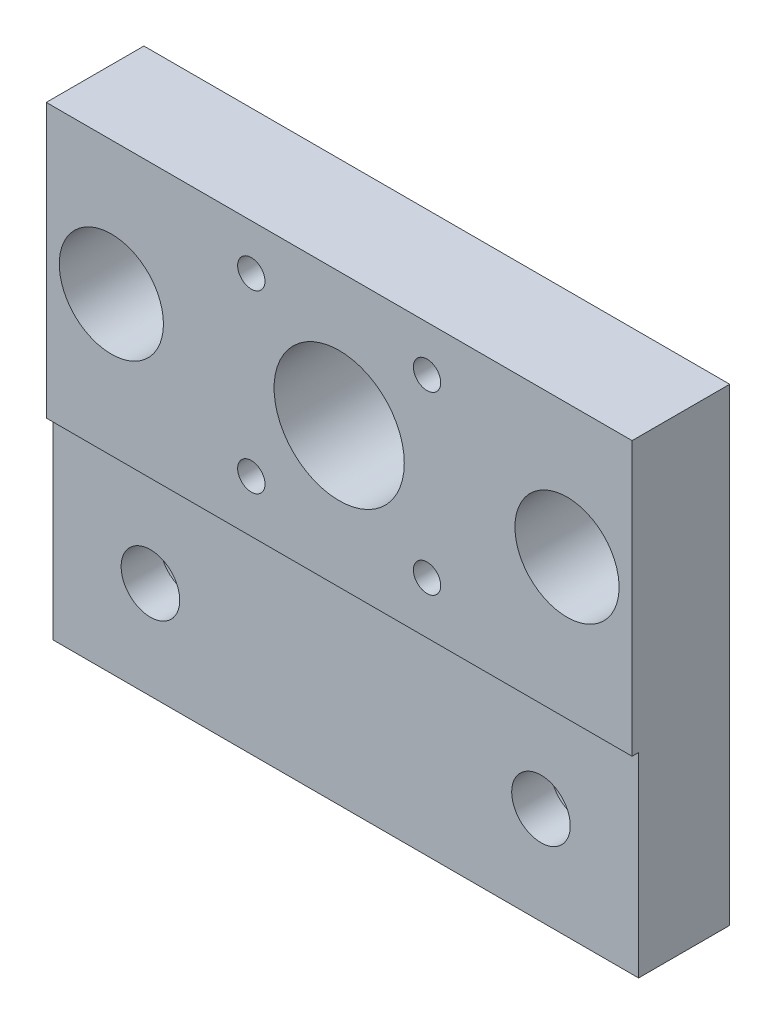
ISO-10303-21;
HEADER;
FILE_DESCRIPTION(('STEP AP214'),'2;1');
FILE_NAME('part.step','',(''),(''),'','','');
FILE_SCHEMA(('AUTOMOTIVE_DESIGN { 1 0 10303 214 1 1 1 1 }'));
ENDSEC;
DATA;
#1=APPLICATION_CONTEXT('core data for automotive mechanical design processes');
#2=APPLICATION_PROTOCOL_DEFINITION('international standard','automotive_design',2000,#1);
#3=PRODUCT_CONTEXT('',#1,'mechanical');
#4=PRODUCT('Part','Part','',(#3));
#5=PRODUCT_RELATED_PRODUCT_CATEGORY('part','',(#4));
#6=PRODUCT_DEFINITION_FORMATION('','',#4);
#7=PRODUCT_DEFINITION_CONTEXT('part definition',#1,'design');
#8=PRODUCT_DEFINITION('design','',#6,#7);
#9=PRODUCT_DEFINITION_SHAPE('','',#8);
#10=(LENGTH_UNIT() NAMED_UNIT(*) SI_UNIT(.MILLI.,.METRE.));
#11=(NAMED_UNIT(*) PLANE_ANGLE_UNIT() SI_UNIT($,.RADIAN.));
#12=(NAMED_UNIT(*) SI_UNIT($,.STERADIAN.) SOLID_ANGLE_UNIT());
#13=UNCERTAINTY_MEASURE_WITH_UNIT(LENGTH_MEASURE(1.E-05),#10,'distance_accuracy_value','');
#14=(GEOMETRIC_REPRESENTATION_CONTEXT(3) GLOBAL_UNCERTAINTY_ASSIGNED_CONTEXT((#13)) GLOBAL_UNIT_ASSIGNED_CONTEXT((#10,
#11,#12)) REPRESENTATION_CONTEXT('',''));
#15=CARTESIAN_POINT('',(0.,0.,0.));
#16=DIRECTION('',(0.,0.,1.));
#17=DIRECTION('',(1.,0.,0.));
#18=AXIS2_PLACEMENT_3D('',#15,#16,#17);
#19=CARTESIAN_POINT('',(45.,-36.,15.));
#20=DIRECTION('',(-1.,0.,0.));
#21=DIRECTION('',(0.,0.,1.));
#22=AXIS2_PLACEMENT_3D('',#19,#20,#21);
#23=PLANE('',#22);
#24=DIRECTION('',(0.,1.,0.));
#25=VECTOR('',#24,1.);
#26=CARTESIAN_POINT('',(45.,-36.,15.));
#27=LINE('',#26,#25);
#28=CARTESIAN_POINT('',(45.,-6.,15.));
#29=VERTEX_POINT('',#28);
#30=CARTESIAN_POINT('',(45.,36.,15.));
#31=VERTEX_POINT('',#30);
#32=EDGE_CURVE('E99',#29,#31,#27,.T.);
#33=ORIENTED_EDGE('',*,*,#32,.F.);
#34=DIRECTION('',(0.,0.,1.));
#35=VECTOR('',#34,1.);
#36=CARTESIAN_POINT('',(45.,-6.,14.));
#37=LINE('',#36,#35);
#38=CARTESIAN_POINT('',(45.,-6.,14.));
#39=VERTEX_POINT('',#38);
#40=EDGE_CURVE('E49',#39,#29,#37,.T.);
#41=ORIENTED_EDGE('',*,*,#40,.F.);
#42=DIRECTION('',(0.,1.,0.));
#43=VECTOR('',#42,1.);
#44=CARTESIAN_POINT('',(45.,-36.,14.));
#45=LINE('',#44,#43);
#46=CARTESIAN_POINT('',(45.,-36.,14.));
#47=VERTEX_POINT('',#46);
#48=EDGE_CURVE('E86',#47,#39,#45,.T.);
#49=ORIENTED_EDGE('',*,*,#48,.F.);
#50=DIRECTION('',(0.,0.,-1.));
#51=VECTOR('',#50,1.);
#52=CARTESIAN_POINT('',(45.,-36.,15.));
#53=LINE('',#52,#51);
#54=CARTESIAN_POINT('',(45.,-36.,0.));
#55=VERTEX_POINT('',#54);
#56=EDGE_CURVE('E78',#47,#55,#53,.T.);
#57=ORIENTED_EDGE('',*,*,#56,.T.);
#58=DIRECTION('',(0.,1.,0.));
#59=VECTOR('',#58,1.);
#60=CARTESIAN_POINT('',(45.,-36.,0.));
#61=LINE('',#60,#59);
#62=CARTESIAN_POINT('',(45.,36.,0.));
#63=VERTEX_POINT('',#62);
#64=EDGE_CURVE('E83',#55,#63,#61,.T.);
#65=ORIENTED_EDGE('',*,*,#64,.T.);
#66=DIRECTION('',(0.,0.,-1.));
#67=VECTOR('',#66,1.);
#68=CARTESIAN_POINT('',(45.,36.,15.));
#69=LINE('',#68,#67);
#70=EDGE_CURVE('E11',#31,#63,#69,.T.);
#71=ORIENTED_EDGE('',*,*,#70,.F.);
#72=EDGE_LOOP('',(#33,#41,#49,#57,#65,#71));
#73=FACE_BOUND('',#72,.T.);
#74=ADVANCED_FACE('F33',(#73),#23,.F.);
#75=CARTESIAN_POINT('',(-45.,36.,15.));
#76=DIRECTION('',(0.,-1.,0.));
#77=DIRECTION('',(0.,0.,-1.));
#78=AXIS2_PLACEMENT_3D('',#75,#76,#77);
#79=PLANE('',#78);
#80=DIRECTION('',(-1.,0.,0.));
#81=VECTOR('',#80,1.);
#82=CARTESIAN_POINT('',(-45.,36.,0.));
#83=LINE('',#82,#81);
#84=CARTESIAN_POINT('',(-45.,36.,0.));
#85=VERTEX_POINT('',#84);
#86=EDGE_CURVE('E103',#63,#85,#83,.T.);
#87=ORIENTED_EDGE('',*,*,#86,.T.);
#88=DIRECTION('',(0.,0.,-1.));
#89=VECTOR('',#88,1.);
#90=CARTESIAN_POINT('',(-45.,36.,15.));
#91=LINE('',#90,#89);
#92=CARTESIAN_POINT('',(-45.,36.,15.));
#93=VERTEX_POINT('',#92);
#94=EDGE_CURVE('E41',#93,#85,#91,.T.);
#95=ORIENTED_EDGE('',*,*,#94,.F.);
#96=DIRECTION('',(-1.,0.,0.));
#97=VECTOR('',#96,1.);
#98=CARTESIAN_POINT('',(-45.,36.,15.));
#99=LINE('',#98,#97);
#100=EDGE_CURVE('E58',#31,#93,#99,.T.);
#101=ORIENTED_EDGE('',*,*,#100,.F.);
#102=ORIENTED_EDGE('',*,*,#70,.T.);
#103=EDGE_LOOP('',(#87,#95,#101,#102));
#104=FACE_BOUND('',#103,.T.);
#105=ADVANCED_FACE('F191',(#104),#79,.F.);
#106=CARTESIAN_POINT('',(-45.,-36.,15.));
#107=DIRECTION('',(1.,0.,0.));
#108=DIRECTION('',(0.,0.,-1.));
#109=AXIS2_PLACEMENT_3D('',#106,#107,#108);
#110=PLANE('',#109);
#111=DIRECTION('',(0.,-1.,0.));
#112=VECTOR('',#111,1.);
#113=CARTESIAN_POINT('',(-45.,-36.,14.));
#114=LINE('',#113,#112);
#115=CARTESIAN_POINT('',(-45.,-6.,14.));
#116=VERTEX_POINT('',#115);
#117=CARTESIAN_POINT('',(-45.,-36.,14.));
#118=VERTEX_POINT('',#117);
#119=EDGE_CURVE('E149',#116,#118,#114,.T.);
#120=ORIENTED_EDGE('',*,*,#119,.F.);
#121=DIRECTION('',(0.,0.,1.));
#122=VECTOR('',#121,1.);
#123=CARTESIAN_POINT('',(-45.,-6.,14.));
#124=LINE('',#123,#122);
#125=CARTESIAN_POINT('',(-45.,-6.,15.));
#126=VERTEX_POINT('',#125);
#127=EDGE_CURVE('E104',#116,#126,#124,.T.);
#128=ORIENTED_EDGE('',*,*,#127,.T.);
#129=DIRECTION('',(0.,-1.,0.));
#130=VECTOR('',#129,1.);
#131=CARTESIAN_POINT('',(-45.,-36.,15.));
#132=LINE('',#131,#130);
#133=EDGE_CURVE('E90',#93,#126,#132,.T.);
#134=ORIENTED_EDGE('',*,*,#133,.F.);
#135=ORIENTED_EDGE('',*,*,#94,.T.);
#136=DIRECTION('',(0.,-1.,0.));
#137=VECTOR('',#136,1.);
#138=CARTESIAN_POINT('',(-45.,-36.,0.));
#139=LINE('',#138,#137);
#140=CARTESIAN_POINT('',(-45.,-36.,0.));
#141=VERTEX_POINT('',#140);
#142=EDGE_CURVE('E100',#85,#141,#139,.T.);
#143=ORIENTED_EDGE('',*,*,#142,.T.);
#144=DIRECTION('',(0.,0.,-1.));
#145=VECTOR('',#144,1.);
#146=CARTESIAN_POINT('',(-45.,-36.,15.));
#147=LINE('',#146,#145);
#148=EDGE_CURVE('E89',#118,#141,#147,.T.);
#149=ORIENTED_EDGE('',*,*,#148,.F.);
#150=EDGE_LOOP('',(#120,#128,#134,#135,#143,#149));
#151=FACE_BOUND('',#150,.T.);
#152=ADVANCED_FACE('F167',(#151),#110,.F.);
#153=CARTESIAN_POINT('',(-45.,-36.,15.));
#154=DIRECTION('',(0.,1.,0.));
#155=DIRECTION('',(0.,0.,1.));
#156=AXIS2_PLACEMENT_3D('',#153,#154,#155);
#157=PLANE('',#156);
#158=ORIENTED_EDGE('',*,*,#56,.F.);
#159=DIRECTION('',(1.,0.,0.));
#160=VECTOR('',#159,1.);
#161=CARTESIAN_POINT('',(-45.,-36.,14.));
#162=LINE('',#161,#160);
#163=EDGE_CURVE('E152',#118,#47,#162,.T.);
#164=ORIENTED_EDGE('',*,*,#163,.F.);
#165=ORIENTED_EDGE('',*,*,#148,.T.);
#166=DIRECTION('',(1.,0.,0.));
#167=VECTOR('',#166,1.);
#168=CARTESIAN_POINT('',(-45.,-36.,0.));
#169=LINE('',#168,#167);
#170=EDGE_CURVE('E93',#141,#55,#169,.T.);
#171=ORIENTED_EDGE('',*,*,#170,.T.);
#172=EDGE_LOOP('',(#158,#164,#165,#171));
#173=FACE_BOUND('',#172,.T.);
#174=ADVANCED_FACE('F94',(#173),#157,.F.);
#175=CARTESIAN_POINT('',(0.,0.,15.));
#176=DIRECTION('',(0.,0.,-1.));
#177=DIRECTION('',(-1.,0.,0.));
#178=AXIS2_PLACEMENT_3D('',#175,#176,#177);
#179=PLANE('',#178);
#180=CARTESIAN_POINT('',(-13.5,1.99999999999984,15.));
#181=DIRECTION('',(0.,0.,-1.));
#182=DIRECTION('',(-1.,0.,0.));
#183=AXIS2_PLACEMENT_3D('',#180,#181,#182);
#184=CIRCLE('',#183,2.1);
#185=CARTESIAN_POINT('',(-15.6,1.99999999999984,15.));
#186=VERTEX_POINT('',#185);
#187=EDGE_CURVE('E213',#186,#186,#184,.T.);
#188=ORIENTED_EDGE('',*,*,#187,.T.);
#189=EDGE_LOOP('',(#188));
#190=FACE_BOUND('',#189,.T.);
#191=CARTESIAN_POINT('',(-13.5,28.9999999999998,15.));
#192=DIRECTION('',(0.,0.,-1.));
#193=DIRECTION('',(-1.,0.,0.));
#194=AXIS2_PLACEMENT_3D('',#191,#192,#193);
#195=CIRCLE('',#194,2.1);
#196=CARTESIAN_POINT('',(-15.6,28.9999999999998,15.));
#197=VERTEX_POINT('',#196);
#198=EDGE_CURVE('E217',#197,#197,#195,.T.);
#199=ORIENTED_EDGE('',*,*,#198,.T.);
#200=EDGE_LOOP('',(#199));
#201=FACE_BOUND('',#200,.T.);
#202=CARTESIAN_POINT('',(13.5,28.9999999999998,15.));
#203=DIRECTION('',(0.,0.,-1.));
#204=DIRECTION('',(-1.,0.,0.));
#205=AXIS2_PLACEMENT_3D('',#202,#203,#204);
#206=CIRCLE('',#205,2.1);
#207=CARTESIAN_POINT('',(11.4,28.9999999999998,15.));
#208=VERTEX_POINT('',#207);
#209=EDGE_CURVE('E221',#208,#208,#206,.T.);
#210=ORIENTED_EDGE('',*,*,#209,.T.);
#211=EDGE_LOOP('',(#210));
#212=FACE_BOUND('',#211,.T.);
#213=CARTESIAN_POINT('',(13.5,1.99999999999985,15.));
#214=DIRECTION('',(0.,0.,-1.));
#215=DIRECTION('',(-1.,0.,0.));
#216=AXIS2_PLACEMENT_3D('',#213,#214,#215);
#217=CIRCLE('',#216,2.1);
#218=CARTESIAN_POINT('',(11.4,1.99999999999985,15.));
#219=VERTEX_POINT('',#218);
#220=EDGE_CURVE('E225',#219,#219,#217,.T.);
#221=ORIENTED_EDGE('',*,*,#220,.T.);
#222=EDGE_LOOP('',(#221));
#223=FACE_BOUND('',#222,.T.);
#224=CARTESIAN_POINT('',(35.,15.4999999999998,15.));
#225=DIRECTION('',(0.,0.,1.));
#226=DIRECTION('',(-1.,0.,0.));
#227=AXIS2_PLACEMENT_3D('',#224,#225,#226);
#228=CIRCLE('',#227,8.);
#229=CARTESIAN_POINT('',(27.,15.4999999999998,15.));
#230=VERTEX_POINT('',#229);
#231=EDGE_CURVE('E117',#230,#230,#228,.T.);
#232=ORIENTED_EDGE('',*,*,#231,.F.);
#233=EDGE_LOOP('',(#232));
#234=FACE_BOUND('',#233,.T.);
#235=CARTESIAN_POINT('',(-35.,15.4999999999998,15.));
#236=DIRECTION('',(0.,0.,1.));
#237=DIRECTION('',(1.,0.,0.));
#238=AXIS2_PLACEMENT_3D('',#235,#236,#237);
#239=CIRCLE('',#238,8.);
#240=CARTESIAN_POINT('',(-27.,15.4999999999998,15.));
#241=VERTEX_POINT('',#240);
#242=EDGE_CURVE('E138',#241,#241,#239,.T.);
#243=ORIENTED_EDGE('',*,*,#242,.F.);
#244=EDGE_LOOP('',(#243));
#245=FACE_BOUND('',#244,.T.);
#246=CARTESIAN_POINT('',(0.,15.4999999999998,15.));
#247=DIRECTION('',(0.,0.,1.));
#248=DIRECTION('',(1.,0.,0.));
#249=AXIS2_PLACEMENT_3D('',#246,#247,#248);
#250=CIRCLE('',#249,10.);
#251=CARTESIAN_POINT('',(10.,15.4999999999998,15.));
#252=VERTEX_POINT('',#251);
#253=EDGE_CURVE('E137',#252,#252,#250,.T.);
#254=ORIENTED_EDGE('',*,*,#253,.F.);
#255=EDGE_LOOP('',(#254));
#256=FACE_BOUND('',#255,.T.);
#257=ORIENTED_EDGE('',*,*,#133,.T.);
#258=DIRECTION('',(-1.,0.,0.));
#259=VECTOR('',#258,1.);
#260=CARTESIAN_POINT('',(-45.,-6.,15.));
#261=LINE('',#260,#259);
#262=EDGE_CURVE('E146',#29,#126,#261,.T.);
#263=ORIENTED_EDGE('',*,*,#262,.F.);
#264=ORIENTED_EDGE('',*,*,#32,.T.);
#265=ORIENTED_EDGE('',*,*,#100,.T.);
#266=EDGE_LOOP('',(#257,#263,#264,#265));
#267=FACE_BOUND('',#266,.T.);
#268=ADVANCED_FACE('F163',(#190,#201,#212,#223,#234,#245,#256,#267),#179,.F.);
#269=CARTESIAN_POINT('',(0.,0.,0.));
#270=DIRECTION('',(0.,0.,-1.));
#271=DIRECTION('',(-1.,0.,0.));
#272=AXIS2_PLACEMENT_3D('',#269,#270,#271);
#273=PLANE('',#272);
#274=CARTESIAN_POINT('',(-13.5,1.99999999999984,0.));
#275=DIRECTION('',(0.,0.,-1.));
#276=DIRECTION('',(-1.,0.,0.));
#277=AXIS2_PLACEMENT_3D('',#274,#275,#276);
#278=CIRCLE('',#277,2.1);
#279=CARTESIAN_POINT('',(-15.6,1.99999999999984,0.));
#280=VERTEX_POINT('',#279);
#281=EDGE_CURVE('E287',#280,#280,#278,.T.);
#282=ORIENTED_EDGE('',*,*,#281,.F.);
#283=EDGE_LOOP('',(#282));
#284=FACE_BOUND('',#283,.T.);
#285=CARTESIAN_POINT('',(-13.5,28.9999999999998,0.));
#286=DIRECTION('',(0.,0.,-1.));
#287=DIRECTION('',(-1.,0.,0.));
#288=AXIS2_PLACEMENT_3D('',#285,#286,#287);
#289=CIRCLE('',#288,2.1);
#290=CARTESIAN_POINT('',(-15.6,28.9999999999998,0.));
#291=VERTEX_POINT('',#290);
#292=EDGE_CURVE('E289',#291,#291,#289,.T.);
#293=ORIENTED_EDGE('',*,*,#292,.F.);
#294=EDGE_LOOP('',(#293));
#295=FACE_BOUND('',#294,.T.);
#296=CARTESIAN_POINT('',(13.5,28.9999999999998,0.));
#297=DIRECTION('',(0.,0.,-1.));
#298=DIRECTION('',(-1.,0.,0.));
#299=AXIS2_PLACEMENT_3D('',#296,#297,#298);
#300=CIRCLE('',#299,2.1);
#301=CARTESIAN_POINT('',(11.4,28.9999999999998,0.));
#302=VERTEX_POINT('',#301);
#303=EDGE_CURVE('E295',#302,#302,#300,.T.);
#304=ORIENTED_EDGE('',*,*,#303,.F.);
#305=EDGE_LOOP('',(#304));
#306=FACE_BOUND('',#305,.T.);
#307=CARTESIAN_POINT('',(13.5,1.99999999999985,0.));
#308=DIRECTION('',(0.,0.,-1.));
#309=DIRECTION('',(-1.,0.,0.));
#310=AXIS2_PLACEMENT_3D('',#307,#308,#309);
#311=CIRCLE('',#310,2.1);
#312=CARTESIAN_POINT('',(11.4,1.99999999999985,0.));
#313=VERTEX_POINT('',#312);
#314=EDGE_CURVE('E299',#313,#313,#311,.T.);
#315=ORIENTED_EDGE('',*,*,#314,.F.);
#316=EDGE_LOOP('',(#315));
#317=FACE_BOUND('',#316,.T.);
#318=CARTESIAN_POINT('',(-30.,-20.9999999999999,0.));
#319=DIRECTION('',(0.,0.,-1.));
#320=DIRECTION('',(-1.,0.,0.));
#321=AXIS2_PLACEMENT_3D('',#318,#319,#320);
#322=CIRCLE('',#321,7.5);
#323=CARTESIAN_POINT('',(-37.5,-20.9999999999999,0.));
#324=VERTEX_POINT('',#323);
#325=EDGE_CURVE('E303',#324,#324,#322,.T.);
#326=ORIENTED_EDGE('',*,*,#325,.F.);
#327=EDGE_LOOP('',(#326));
#328=FACE_BOUND('',#327,.T.);
#329=CARTESIAN_POINT('',(30.,-20.9999999999999,0.));
#330=DIRECTION('',(0.,0.,-1.));
#331=DIRECTION('',(-1.,0.,0.));
#332=AXIS2_PLACEMENT_3D('',#329,#330,#331);
#333=CIRCLE('',#332,7.5);
#334=CARTESIAN_POINT('',(22.5,-20.9999999999999,0.));
#335=VERTEX_POINT('',#334);
#336=EDGE_CURVE('E130',#335,#335,#333,.T.);
#337=ORIENTED_EDGE('',*,*,#336,.F.);
#338=EDGE_LOOP('',(#337));
#339=FACE_BOUND('',#338,.T.);
#340=CARTESIAN_POINT('',(35.,15.4999999999998,0.));
#341=DIRECTION('',(0.,0.,1.));
#342=DIRECTION('',(-1.,0.,0.));
#343=AXIS2_PLACEMENT_3D('',#340,#341,#342);
#344=CIRCLE('',#343,8.);
#345=CARTESIAN_POINT('',(27.,15.4999999999998,0.));
#346=VERTEX_POINT('',#345);
#347=EDGE_CURVE('E122',#346,#346,#344,.T.);
#348=ORIENTED_EDGE('',*,*,#347,.T.);
#349=EDGE_LOOP('',(#348));
#350=FACE_BOUND('',#349,.T.);
#351=CARTESIAN_POINT('',(-35.,15.4999999999998,0.));
#352=DIRECTION('',(0.,0.,1.));
#353=DIRECTION('',(1.,0.,0.));
#354=AXIS2_PLACEMENT_3D('',#351,#352,#353);
#355=CIRCLE('',#354,8.);
#356=CARTESIAN_POINT('',(-27.,15.4999999999998,0.));
#357=VERTEX_POINT('',#356);
#358=EDGE_CURVE('E134',#357,#357,#355,.T.);
#359=ORIENTED_EDGE('',*,*,#358,.T.);
#360=EDGE_LOOP('',(#359));
#361=FACE_BOUND('',#360,.T.);
#362=CARTESIAN_POINT('',(0.,15.4999999999998,0.));
#363=DIRECTION('',(0.,0.,1.));
#364=DIRECTION('',(1.,0.,0.));
#365=AXIS2_PLACEMENT_3D('',#362,#363,#364);
#366=CIRCLE('',#365,10.);
#367=CARTESIAN_POINT('',(10.,15.4999999999998,0.));
#368=VERTEX_POINT('',#367);
#369=EDGE_CURVE('E143',#368,#368,#366,.T.);
#370=ORIENTED_EDGE('',*,*,#369,.T.);
#371=EDGE_LOOP('',(#370));
#372=FACE_BOUND('',#371,.T.);
#373=ORIENTED_EDGE('',*,*,#64,.F.);
#374=ORIENTED_EDGE('',*,*,#170,.F.);
#375=ORIENTED_EDGE('',*,*,#142,.F.);
#376=ORIENTED_EDGE('',*,*,#86,.F.);
#377=EDGE_LOOP('',(#373,#374,#375,#376));
#378=FACE_BOUND('',#377,.T.);
#379=ADVANCED_FACE('F102',(#284,#295,#306,#317,#328,#339,#350,#361,#372,#378),#273,.T.);
#380=CARTESIAN_POINT('',(-45.,-6.,14.));
#381=DIRECTION('',(0.,1.,0.));
#382=DIRECTION('',(0.,0.,1.));
#383=AXIS2_PLACEMENT_3D('',#380,#381,#382);
#384=PLANE('',#383);
#385=ORIENTED_EDGE('',*,*,#262,.T.);
#386=ORIENTED_EDGE('',*,*,#127,.F.);
#387=DIRECTION('',(-1.,0.,0.));
#388=VECTOR('',#387,1.);
#389=CARTESIAN_POINT('',(-45.,-6.,14.));
#390=LINE('',#389,#388);
#391=EDGE_CURVE('E156',#39,#116,#390,.T.);
#392=ORIENTED_EDGE('',*,*,#391,.F.);
#393=ORIENTED_EDGE('',*,*,#40,.T.);
#394=EDGE_LOOP('',(#385,#386,#392,#393));
#395=FACE_BOUND('',#394,.T.);
#396=ADVANCED_FACE('F169',(#395),#384,.F.);
#397=CARTESIAN_POINT('',(0.,0.,14.));
#398=DIRECTION('',(0.,0.,-1.));
#399=DIRECTION('',(-1.,0.,0.));
#400=AXIS2_PLACEMENT_3D('',#397,#398,#399);
#401=PLANE('',#400);
#402=CARTESIAN_POINT('',(-30.,-20.9999999999999,14.));
#403=DIRECTION('',(0.,0.,-1.));
#404=DIRECTION('',(-1.,0.,0.));
#405=AXIS2_PLACEMENT_3D('',#402,#403,#404);
#406=CIRCLE('',#405,4.5);
#407=CARTESIAN_POINT('',(-34.5,-20.9999999999999,14.));
#408=VERTEX_POINT('',#407);
#409=EDGE_CURVE('E36',#408,#408,#406,.T.);
#410=ORIENTED_EDGE('',*,*,#409,.T.);
#411=EDGE_LOOP('',(#410));
#412=FACE_BOUND('',#411,.T.);
#413=CARTESIAN_POINT('',(30.,-20.9999999999999,14.));
#414=DIRECTION('',(0.,0.,-1.));
#415=DIRECTION('',(-1.,0.,0.));
#416=AXIS2_PLACEMENT_3D('',#413,#414,#415);
#417=CIRCLE('',#416,4.49999999999999);
#418=CARTESIAN_POINT('',(25.5,-20.9999999999999,14.));
#419=VERTEX_POINT('',#418);
#420=EDGE_CURVE('E115',#419,#419,#417,.T.);
#421=ORIENTED_EDGE('',*,*,#420,.T.);
#422=EDGE_LOOP('',(#421));
#423=FACE_BOUND('',#422,.T.);
#424=ORIENTED_EDGE('',*,*,#119,.T.);
#425=ORIENTED_EDGE('',*,*,#163,.T.);
#426=ORIENTED_EDGE('',*,*,#48,.T.);
#427=ORIENTED_EDGE('',*,*,#391,.T.);
#428=EDGE_LOOP('',(#424,#425,#426,#427));
#429=FACE_BOUND('',#428,.T.);
#430=ADVANCED_FACE('F173',(#412,#423,#429),#401,.F.);
#431=CARTESIAN_POINT('',(0.,15.4999999999998,0.));
#432=DIRECTION('',(0.,0.,1.));
#433=DIRECTION('',(1.,0.,0.));
#434=AXIS2_PLACEMENT_3D('',#431,#432,#433);
#435=CYLINDRICAL_SURFACE('',#434,10.);
#436=ORIENTED_EDGE('',*,*,#369,.F.);
#437=EDGE_LOOP('',(#436));
#438=FACE_BOUND('',#437,.T.);
#439=ORIENTED_EDGE('',*,*,#253,.T.);
#440=EDGE_LOOP('',(#439));
#441=FACE_BOUND('',#440,.T.);
#442=ADVANCED_FACE('F178',(#438,#441),#435,.F.);
#443=CARTESIAN_POINT('',(-35.,15.4999999999998,0.));
#444=DIRECTION('',(0.,0.,1.));
#445=DIRECTION('',(1.,0.,0.));
#446=AXIS2_PLACEMENT_3D('',#443,#444,#445);
#447=CYLINDRICAL_SURFACE('',#446,8.);
#448=ORIENTED_EDGE('',*,*,#358,.F.);
#449=EDGE_LOOP('',(#448));
#450=FACE_BOUND('',#449,.T.);
#451=ORIENTED_EDGE('',*,*,#242,.T.);
#452=EDGE_LOOP('',(#451));
#453=FACE_BOUND('',#452,.T.);
#454=ADVANCED_FACE('F185',(#450,#453),#447,.F.);
#455=CARTESIAN_POINT('',(35.,15.4999999999998,0.));
#456=DIRECTION('',(0.,0.,1.));
#457=DIRECTION('',(1.,0.,0.));
#458=AXIS2_PLACEMENT_3D('',#455,#456,#457);
#459=CYLINDRICAL_SURFACE('',#458,8.);
#460=ORIENTED_EDGE('',*,*,#347,.F.);
#461=EDGE_LOOP('',(#460));
#462=FACE_BOUND('',#461,.T.);
#463=ORIENTED_EDGE('',*,*,#231,.T.);
#464=EDGE_LOOP('',(#463));
#465=FACE_BOUND('',#464,.T.);
#466=ADVANCED_FACE('F234',(#462,#465),#459,.F.);
#467=CARTESIAN_POINT('',(30.,-20.9999999999999,0.));
#468=DIRECTION('',(0.,0.,-1.));
#469=DIRECTION('',(-1.,0.,0.));
#470=AXIS2_PLACEMENT_3D('',#467,#468,#469);
#471=CYLINDRICAL_SURFACE('',#470,4.49999999999999);
#472=CARTESIAN_POINT('',(30.,-20.9999999999999,8.));
#473=DIRECTION('',(0.,0.,-1.));
#474=DIRECTION('',(-1.,0.,0.));
#475=AXIS2_PLACEMENT_3D('',#472,#473,#474);
#476=CIRCLE('',#475,4.5);
#477=CARTESIAN_POINT('',(25.5,-20.9999999999999,8.));
#478=VERTEX_POINT('',#477);
#479=EDGE_CURVE('E118',#478,#478,#476,.T.);
#480=ORIENTED_EDGE('',*,*,#479,.T.);
#481=EDGE_LOOP('',(#480));
#482=FACE_BOUND('',#481,.T.);
#483=ORIENTED_EDGE('',*,*,#420,.F.);
#484=EDGE_LOOP('',(#483));
#485=FACE_BOUND('',#484,.T.);
#486=ADVANCED_FACE('F240',(#482,#485),#471,.F.);
#487=CARTESIAN_POINT('',(34.5,-20.9999999999999,8.));
#488=DIRECTION('',(0.,0.,1.));
#489=DIRECTION('',(1.,0.,0.));
#490=AXIS2_PLACEMENT_3D('',#487,#488,#489);
#491=PLANE('',#490);
#492=ORIENTED_EDGE('',*,*,#479,.F.);
#493=EDGE_LOOP('',(#492));
#494=FACE_BOUND('',#493,.T.);
#495=CARTESIAN_POINT('',(30.,-20.9999999999999,8.));
#496=DIRECTION('',(0.,0.,-1.));
#497=DIRECTION('',(-1.,0.,0.));
#498=AXIS2_PLACEMENT_3D('',#495,#496,#497);
#499=CIRCLE('',#498,7.5);
#500=CARTESIAN_POINT('',(22.5,-20.9999999999999,8.));
#501=VERTEX_POINT('',#500);
#502=EDGE_CURVE('E125',#501,#501,#499,.T.);
#503=ORIENTED_EDGE('',*,*,#502,.T.);
#504=EDGE_LOOP('',(#503));
#505=FACE_BOUND('',#504,.T.);
#506=ADVANCED_FACE('F247',(#494,#505),#491,.F.);
#507=CARTESIAN_POINT('',(30.,-20.9999999999999,0.));
#508=DIRECTION('',(0.,0.,-1.));
#509=DIRECTION('',(-1.,0.,0.));
#510=AXIS2_PLACEMENT_3D('',#507,#508,#509);
#511=CYLINDRICAL_SURFACE('',#510,7.5);
#512=ORIENTED_EDGE('',*,*,#502,.F.);
#513=EDGE_LOOP('',(#512));
#514=FACE_BOUND('',#513,.T.);
#515=ORIENTED_EDGE('',*,*,#336,.T.);
#516=EDGE_LOOP('',(#515));
#517=FACE_BOUND('',#516,.T.);
#518=ADVANCED_FACE('F250',(#514,#517),#511,.F.);
#519=CARTESIAN_POINT('',(-30.,-20.9999999999999,0.));
#520=DIRECTION('',(0.,0.,-1.));
#521=DIRECTION('',(-1.,0.,0.));
#522=AXIS2_PLACEMENT_3D('',#519,#520,#521);
#523=CYLINDRICAL_SURFACE('',#522,4.5);
#524=CARTESIAN_POINT('',(-30.,-20.9999999999999,8.));
#525=DIRECTION('',(0.,0.,-1.));
#526=DIRECTION('',(-1.,0.,0.));
#527=AXIS2_PLACEMENT_3D('',#524,#525,#526);
#528=CIRCLE('',#527,4.5);
#529=CARTESIAN_POINT('',(-34.5,-20.9999999999999,8.));
#530=VERTEX_POINT('',#529);
#531=EDGE_CURVE('E309',#530,#530,#528,.T.);
#532=ORIENTED_EDGE('',*,*,#531,.T.);
#533=EDGE_LOOP('',(#532));
#534=FACE_BOUND('',#533,.T.);
#535=ORIENTED_EDGE('',*,*,#409,.F.);
#536=EDGE_LOOP('',(#535));
#537=FACE_BOUND('',#536,.T.);
#538=ADVANCED_FACE('F254',(#534,#537),#523,.F.);
#539=CARTESIAN_POINT('',(-25.5,-20.9999999999999,8.));
#540=DIRECTION('',(0.,0.,1.));
#541=DIRECTION('',(1.,0.,0.));
#542=AXIS2_PLACEMENT_3D('',#539,#540,#541);
#543=PLANE('',#542);
#544=ORIENTED_EDGE('',*,*,#531,.F.);
#545=EDGE_LOOP('',(#544));
#546=FACE_BOUND('',#545,.T.);
#547=CARTESIAN_POINT('',(-30.,-20.9999999999999,8.));
#548=DIRECTION('',(0.,0.,-1.));
#549=DIRECTION('',(-1.,0.,0.));
#550=AXIS2_PLACEMENT_3D('',#547,#548,#549);
#551=CIRCLE('',#550,7.5);
#552=CARTESIAN_POINT('',(-37.5,-20.9999999999999,8.));
#553=VERTEX_POINT('',#552);
#554=EDGE_CURVE('E306',#553,#553,#551,.T.);
#555=ORIENTED_EDGE('',*,*,#554,.T.);
#556=EDGE_LOOP('',(#555));
#557=FACE_BOUND('',#556,.T.);
#558=ADVANCED_FACE('F258',(#546,#557),#543,.F.);
#559=CARTESIAN_POINT('',(-30.,-20.9999999999999,0.));
#560=DIRECTION('',(0.,0.,-1.));
#561=DIRECTION('',(-1.,0.,0.));
#562=AXIS2_PLACEMENT_3D('',#559,#560,#561);
#563=CYLINDRICAL_SURFACE('',#562,7.5);
#564=ORIENTED_EDGE('',*,*,#554,.F.);
#565=EDGE_LOOP('',(#564));
#566=FACE_BOUND('',#565,.T.);
#567=ORIENTED_EDGE('',*,*,#325,.T.);
#568=EDGE_LOOP('',(#567));
#569=FACE_BOUND('',#568,.T.);
#570=ADVANCED_FACE('F262',(#566,#569),#563,.F.);
#571=CARTESIAN_POINT('',(13.5,1.99999999999985,0.));
#572=DIRECTION('',(0.,0.,-1.));
#573=DIRECTION('',(-1.,0.,0.));
#574=AXIS2_PLACEMENT_3D('',#571,#572,#573);
#575=CYLINDRICAL_SURFACE('',#574,2.1);
#576=ORIENTED_EDGE('',*,*,#220,.F.);
#577=EDGE_LOOP('',(#576));
#578=FACE_BOUND('',#577,.T.);
#579=ORIENTED_EDGE('',*,*,#314,.T.);
#580=EDGE_LOOP('',(#579));
#581=FACE_BOUND('',#580,.T.);
#582=ADVANCED_FACE('F266',(#578,#581),#575,.F.);
#583=CARTESIAN_POINT('',(13.5,28.9999999999998,0.));
#584=DIRECTION('',(0.,0.,-1.));
#585=DIRECTION('',(-1.,0.,0.));
#586=AXIS2_PLACEMENT_3D('',#583,#584,#585);
#587=CYLINDRICAL_SURFACE('',#586,2.1);
#588=ORIENTED_EDGE('',*,*,#209,.F.);
#589=EDGE_LOOP('',(#588));
#590=FACE_BOUND('',#589,.T.);
#591=ORIENTED_EDGE('',*,*,#303,.T.);
#592=EDGE_LOOP('',(#591));
#593=FACE_BOUND('',#592,.T.);
#594=ADVANCED_FACE('F270',(#590,#593),#587,.F.);
#595=CARTESIAN_POINT('',(-13.5,28.9999999999998,0.));
#596=DIRECTION('',(0.,0.,-1.));
#597=DIRECTION('',(-1.,0.,0.));
#598=AXIS2_PLACEMENT_3D('',#595,#596,#597);
#599=CYLINDRICAL_SURFACE('',#598,2.1);
#600=ORIENTED_EDGE('',*,*,#198,.F.);
#601=EDGE_LOOP('',(#600));
#602=FACE_BOUND('',#601,.T.);
#603=ORIENTED_EDGE('',*,*,#292,.T.);
#604=EDGE_LOOP('',(#603));
#605=FACE_BOUND('',#604,.T.);
#606=ADVANCED_FACE('F274',(#602,#605),#599,.F.);
#607=CARTESIAN_POINT('',(-13.5,1.99999999999984,0.));
#608=DIRECTION('',(0.,0.,-1.));
#609=DIRECTION('',(-1.,0.,0.));
#610=AXIS2_PLACEMENT_3D('',#607,#608,#609);
#611=CYLINDRICAL_SURFACE('',#610,2.1);
#612=ORIENTED_EDGE('',*,*,#187,.F.);
#613=EDGE_LOOP('',(#612));
#614=FACE_BOUND('',#613,.T.);
#615=ORIENTED_EDGE('',*,*,#281,.T.);
#616=EDGE_LOOP('',(#615));
#617=FACE_BOUND('',#616,.T.);
#618=ADVANCED_FACE('F278',(#614,#617),#611,.F.);
#619=CLOSED_SHELL('',(#74,#105,#152,#174,#268,#379,#396,#430,#442,#454,#466,#486,#506,#518,#538,
#558,#570,#582,#594,#606,#618));
#620=MANIFOLD_SOLID_BREP('B2',#619);
#621=ADVANCED_BREP_SHAPE_REPRESENTATION('',(#18,#620),#14);
#622=SHAPE_DEFINITION_REPRESENTATION(#9,#621);
ENDSEC;
END-ISO-10303-21;
